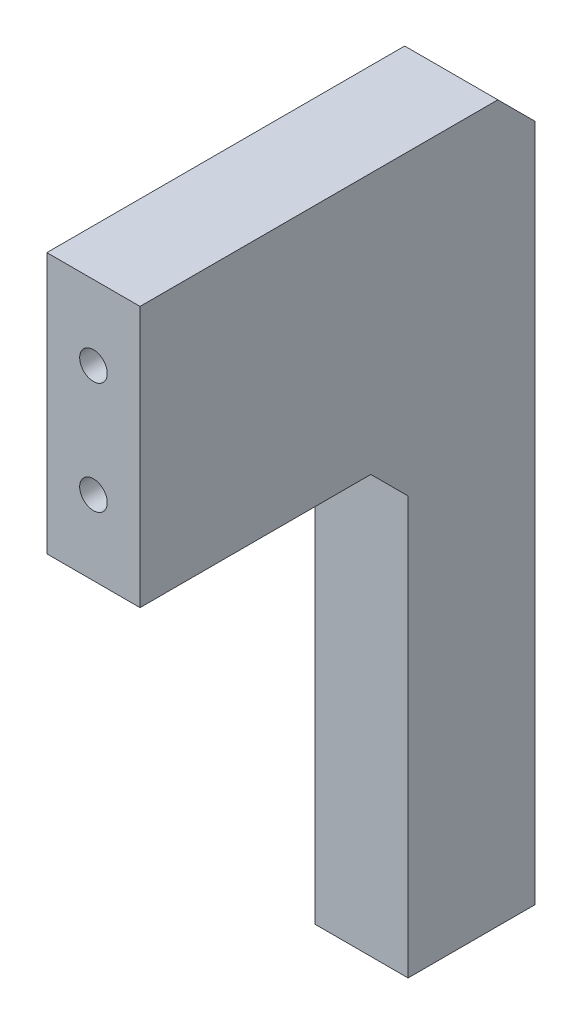
ISO-10303-21;
HEADER;
FILE_DESCRIPTION(('STEP AP214'),'2;1');
FILE_NAME('part.step','',(''),(''),'','','');
FILE_SCHEMA(('AUTOMOTIVE_DESIGN { 1 0 10303 214 1 1 1 1 }'));
ENDSEC;
DATA;
#1=APPLICATION_CONTEXT('core data for automotive mechanical design processes');
#2=APPLICATION_PROTOCOL_DEFINITION('international standard','automotive_design',2000,#1);
#3=PRODUCT_CONTEXT('',#1,'mechanical');
#4=PRODUCT('Part','Part','',(#3));
#5=PRODUCT_RELATED_PRODUCT_CATEGORY('part','',(#4));
#6=PRODUCT_DEFINITION_FORMATION('','',#4);
#7=PRODUCT_DEFINITION_CONTEXT('part definition',#1,'design');
#8=PRODUCT_DEFINITION('design','',#6,#7);
#9=PRODUCT_DEFINITION_SHAPE('','',#8);
#10=(LENGTH_UNIT() NAMED_UNIT(*) SI_UNIT(.MILLI.,.METRE.));
#11=(NAMED_UNIT(*) PLANE_ANGLE_UNIT() SI_UNIT($,.RADIAN.));
#12=(NAMED_UNIT(*) SI_UNIT($,.STERADIAN.) SOLID_ANGLE_UNIT());
#13=UNCERTAINTY_MEASURE_WITH_UNIT(LENGTH_MEASURE(1.E-05),#10,'distance_accuracy_value','');
#14=(GEOMETRIC_REPRESENTATION_CONTEXT(3) GLOBAL_UNCERTAINTY_ASSIGNED_CONTEXT((#13)) GLOBAL_UNIT_ASSIGNED_CONTEXT((#10,
#11,#12)) REPRESENTATION_CONTEXT('',''));
#15=CARTESIAN_POINT('',(0.,0.,0.));
#16=DIRECTION('',(0.,0.,1.));
#17=DIRECTION('',(1.,0.,0.));
#18=AXIS2_PLACEMENT_3D('',#15,#16,#17);
#19=CARTESIAN_POINT('',(6.25,96.,0.));
#20=DIRECTION('',(0.,0.,1.));
#21=DIRECTION('',(0.,-1.,0.));
#22=AXIS2_PLACEMENT_3D('',#19,#20,#21);
#23=PLANE('',#22);
#24=DIRECTION('',(0.,1.,0.));
#25=VECTOR('',#24,1.);
#26=CARTESIAN_POINT('',(-6.25,96.,0.));
#27=LINE('',#26,#25);
#28=CARTESIAN_POINT('',(-6.25,0.,0.));
#29=VERTEX_POINT('',#28);
#30=CARTESIAN_POINT('',(-6.25,91.,0.));
#31=VERTEX_POINT('',#30);
#32=EDGE_CURVE('E138',#29,#31,#27,.T.);
#33=ORIENTED_EDGE('',*,*,#32,.T.);
#34=DIRECTION('',(1.,0.,0.));
#35=VECTOR('',#34,1.);
#36=CARTESIAN_POINT('',(6.25,91.,0.));
#37=LINE('',#36,#35);
#38=CARTESIAN_POINT('',(6.25,91.,0.));
#39=VERTEX_POINT('',#38);
#40=EDGE_CURVE('E53',#31,#39,#37,.T.);
#41=ORIENTED_EDGE('',*,*,#40,.T.);
#42=DIRECTION('',(0.,1.,0.));
#43=VECTOR('',#42,1.);
#44=CARTESIAN_POINT('',(6.25,96.,0.));
#45=LINE('',#44,#43);
#46=CARTESIAN_POINT('',(6.25,0.,0.));
#47=VERTEX_POINT('',#46);
#48=EDGE_CURVE('E139',#47,#39,#45,.T.);
#49=ORIENTED_EDGE('',*,*,#48,.F.);
#50=DIRECTION('',(-1.,0.,0.));
#51=VECTOR('',#50,1.);
#52=CARTESIAN_POINT('',(6.25,0.,0.));
#53=LINE('',#52,#51);
#54=EDGE_CURVE('E153',#47,#29,#53,.T.);
#55=ORIENTED_EDGE('',*,*,#54,.T.);
#56=EDGE_LOOP('',(#33,#41,#49,#55));
#57=FACE_BOUND('',#56,.T.);
#58=ADVANCED_FACE('F38',(#57),#23,.F.);
#59=CARTESIAN_POINT('',(6.25,96.,53.));
#60=DIRECTION('',(0.,-1.,0.));
#61=DIRECTION('',(0.,0.,-1.));
#62=AXIS2_PLACEMENT_3D('',#59,#60,#61);
#63=PLANE('',#62);
#64=DIRECTION('',(0.,0.,1.));
#65=VECTOR('',#64,1.);
#66=CARTESIAN_POINT('',(6.25,96.,53.));
#67=LINE('',#66,#65);
#68=CARTESIAN_POINT('',(6.25,96.,4.99999999999999));
#69=VERTEX_POINT('',#68);
#70=CARTESIAN_POINT('',(6.25,96.,53.));
#71=VERTEX_POINT('',#70);
#72=EDGE_CURVE('E141',#69,#71,#67,.T.);
#73=ORIENTED_EDGE('',*,*,#72,.F.);
#74=DIRECTION('',(-1.,0.,0.));
#75=VECTOR('',#74,1.);
#76=CARTESIAN_POINT('',(6.25,96.,4.99999999999999));
#77=LINE('',#76,#75);
#78=CARTESIAN_POINT('',(-6.25,96.,4.99999999999999));
#79=VERTEX_POINT('',#78);
#80=EDGE_CURVE('E181',#69,#79,#77,.T.);
#81=ORIENTED_EDGE('',*,*,#80,.T.);
#82=DIRECTION('',(0.,0.,1.));
#83=VECTOR('',#82,1.);
#84=CARTESIAN_POINT('',(-6.25,96.,53.));
#85=LINE('',#84,#83);
#86=CARTESIAN_POINT('',(-6.25,96.,53.));
#87=VERTEX_POINT('',#86);
#88=EDGE_CURVE('E155',#79,#87,#85,.T.);
#89=ORIENTED_EDGE('',*,*,#88,.T.);
#90=DIRECTION('',(-1.,0.,0.));
#91=VECTOR('',#90,1.);
#92=CARTESIAN_POINT('',(6.25,96.,53.));
#93=LINE('',#92,#91);
#94=EDGE_CURVE('E173',#71,#87,#93,.T.);
#95=ORIENTED_EDGE('',*,*,#94,.F.);
#96=EDGE_LOOP('',(#73,#81,#89,#95));
#97=FACE_BOUND('',#96,.T.);
#98=ADVANCED_FACE('F216',(#97),#63,.F.);
#99=CARTESIAN_POINT('',(6.25,61.,53.));
#100=DIRECTION('',(0.,0.,-1.));
#101=DIRECTION('',(-1.,0.,0.));
#102=AXIS2_PLACEMENT_3D('',#99,#100,#101);
#103=PLANE('',#102);
#104=CARTESIAN_POINT('',(0.,86.,53.));
#105=DIRECTION('',(0.,0.,1.));
#106=DIRECTION('',(1.,0.,0.));
#107=AXIS2_PLACEMENT_3D('',#104,#105,#106);
#108=CIRCLE('',#107,1.85);
#109=CARTESIAN_POINT('',(1.85,86.,53.));
#110=VERTEX_POINT('',#109);
#111=EDGE_CURVE('E121',#110,#110,#108,.T.);
#112=ORIENTED_EDGE('',*,*,#111,.F.);
#113=EDGE_LOOP('',(#112));
#114=FACE_BOUND('',#113,.T.);
#115=CARTESIAN_POINT('',(0.,71.,53.));
#116=DIRECTION('',(0.,0.,1.));
#117=DIRECTION('',(1.,0.,0.));
#118=AXIS2_PLACEMENT_3D('',#115,#116,#117);
#119=CIRCLE('',#118,1.85);
#120=CARTESIAN_POINT('',(1.85,71.,53.));
#121=VERTEX_POINT('',#120);
#122=EDGE_CURVE('E132',#121,#121,#119,.T.);
#123=ORIENTED_EDGE('',*,*,#122,.F.);
#124=EDGE_LOOP('',(#123));
#125=FACE_BOUND('',#124,.T.);
#126=DIRECTION('',(0.,-1.,0.));
#127=VECTOR('',#126,1.);
#128=CARTESIAN_POINT('',(-6.25,61.,53.));
#129=LINE('',#128,#127);
#130=CARTESIAN_POINT('',(-6.25,61.,53.));
#131=VERTEX_POINT('',#130);
#132=EDGE_CURVE('E157',#87,#131,#129,.T.);
#133=ORIENTED_EDGE('',*,*,#132,.T.);
#134=DIRECTION('',(-1.,0.,0.));
#135=VECTOR('',#134,1.);
#136=CARTESIAN_POINT('',(6.25,61.,53.));
#137=LINE('',#136,#135);
#138=CARTESIAN_POINT('',(6.25,61.,53.));
#139=VERTEX_POINT('',#138);
#140=EDGE_CURVE('E170',#139,#131,#137,.T.);
#141=ORIENTED_EDGE('',*,*,#140,.F.);
#142=DIRECTION('',(0.,-1.,0.));
#143=VECTOR('',#142,1.);
#144=CARTESIAN_POINT('',(6.25,61.,53.));
#145=LINE('',#144,#143);
#146=EDGE_CURVE('E144',#71,#139,#145,.T.);
#147=ORIENTED_EDGE('',*,*,#146,.F.);
#148=ORIENTED_EDGE('',*,*,#94,.T.);
#149=EDGE_LOOP('',(#133,#141,#147,#148));
#150=FACE_BOUND('',#149,.T.);
#151=ADVANCED_FACE('F219',(#114,#125,#150),#103,.F.);
#152=CARTESIAN_POINT('',(6.25,61.,17.045));
#153=DIRECTION('',(0.,1.,0.));
#154=DIRECTION('',(0.,0.,1.));
#155=AXIS2_PLACEMENT_3D('',#152,#153,#154);
#156=PLANE('',#155);
#157=DIRECTION('',(0.,0.,-1.));
#158=VECTOR('',#157,1.);
#159=CARTESIAN_POINT('',(-6.25,61.,17.045));
#160=LINE('',#159,#158);
#161=CARTESIAN_POINT('',(-6.25,61.,22.045));
#162=VERTEX_POINT('',#161);
#163=EDGE_CURVE('E159',#131,#162,#160,.T.);
#164=ORIENTED_EDGE('',*,*,#163,.T.);
#165=DIRECTION('',(1.,0.,0.));
#166=VECTOR('',#165,1.);
#167=CARTESIAN_POINT('',(6.25,61.,22.045));
#168=LINE('',#167,#166);
#169=CARTESIAN_POINT('',(6.25,61.,22.045));
#170=VERTEX_POINT('',#169);
#171=EDGE_CURVE('E179',#162,#170,#168,.T.);
#172=ORIENTED_EDGE('',*,*,#171,.T.);
#173=DIRECTION('',(0.,0.,-1.));
#174=VECTOR('',#173,1.);
#175=CARTESIAN_POINT('',(6.25,61.,17.045));
#176=LINE('',#175,#174);
#177=EDGE_CURVE('E146',#139,#170,#176,.T.);
#178=ORIENTED_EDGE('',*,*,#177,.F.);
#179=ORIENTED_EDGE('',*,*,#140,.T.);
#180=EDGE_LOOP('',(#164,#172,#178,#179));
#181=FACE_BOUND('',#180,.T.);
#182=ADVANCED_FACE('F196',(#181),#156,.F.);
#183=CARTESIAN_POINT('',(6.25,0.,17.045));
#184=DIRECTION('',(0.,0.,-1.));
#185=DIRECTION('',(-1.,0.,0.));
#186=AXIS2_PLACEMENT_3D('',#183,#184,#185);
#187=PLANE('',#186);
#188=DIRECTION('',(0.,-1.,0.));
#189=VECTOR('',#188,1.);
#190=CARTESIAN_POINT('',(6.25,0.,17.045));
#191=LINE('',#190,#189);
#192=CARTESIAN_POINT('',(6.25,56.,17.045));
#193=VERTEX_POINT('',#192);
#194=CARTESIAN_POINT('',(6.25,0.,17.045));
#195=VERTEX_POINT('',#194);
#196=EDGE_CURVE('E149',#193,#195,#191,.T.);
#197=ORIENTED_EDGE('',*,*,#196,.F.);
#198=DIRECTION('',(-1.,0.,0.));
#199=VECTOR('',#198,1.);
#200=CARTESIAN_POINT('',(-6.25,56.,17.045));
#201=LINE('',#200,#199);
#202=CARTESIAN_POINT('',(-6.25,56.,17.045));
#203=VERTEX_POINT('',#202);
#204=EDGE_CURVE('E176',#193,#203,#201,.T.);
#205=ORIENTED_EDGE('',*,*,#204,.T.);
#206=DIRECTION('',(0.,-1.,0.));
#207=VECTOR('',#206,1.);
#208=CARTESIAN_POINT('',(-6.25,0.,17.045));
#209=LINE('',#208,#207);
#210=CARTESIAN_POINT('',(-6.25,0.,17.045));
#211=VERTEX_POINT('',#210);
#212=EDGE_CURVE('E162',#203,#211,#209,.T.);
#213=ORIENTED_EDGE('',*,*,#212,.T.);
#214=DIRECTION('',(-1.,0.,0.));
#215=VECTOR('',#214,1.);
#216=CARTESIAN_POINT('',(6.25,0.,17.045));
#217=LINE('',#216,#215);
#218=EDGE_CURVE('E167',#195,#211,#217,.T.);
#219=ORIENTED_EDGE('',*,*,#218,.F.);
#220=EDGE_LOOP('',(#197,#205,#213,#219));
#221=FACE_BOUND('',#220,.T.);
#222=ADVANCED_FACE('F206',(#221),#187,.F.);
#223=CARTESIAN_POINT('',(6.25,0.,0.));
#224=DIRECTION('',(0.,1.,0.));
#225=DIRECTION('',(0.,0.,1.));
#226=AXIS2_PLACEMENT_3D('',#223,#224,#225);
#227=PLANE('',#226);
#228=CARTESIAN_POINT('',(0.,0.,10.22));
#229=DIRECTION('',(0.,-1.,0.));
#230=DIRECTION('',(0.,0.,-1.));
#231=AXIS2_PLACEMENT_3D('',#228,#229,#230);
#232=CIRCLE('',#231,1.85);
#233=CARTESIAN_POINT('',(0.,0.,8.37));
#234=VERTEX_POINT('',#233);
#235=EDGE_CURVE('E122',#234,#234,#232,.T.);
#236=ORIENTED_EDGE('',*,*,#235,.F.);
#237=EDGE_LOOP('',(#236));
#238=FACE_BOUND('',#237,.T.);
#239=DIRECTION('',(0.,0.,-1.));
#240=VECTOR('',#239,1.);
#241=CARTESIAN_POINT('',(-6.25,0.,0.));
#242=LINE('',#241,#240);
#243=EDGE_CURVE('E142',#211,#29,#242,.T.);
#244=ORIENTED_EDGE('',*,*,#243,.T.);
#245=ORIENTED_EDGE('',*,*,#54,.F.);
#246=DIRECTION('',(0.,0.,-1.));
#247=VECTOR('',#246,1.);
#248=CARTESIAN_POINT('',(6.25,0.,0.));
#249=LINE('',#248,#247);
#250=EDGE_CURVE('E151',#195,#47,#249,.T.);
#251=ORIENTED_EDGE('',*,*,#250,.F.);
#252=ORIENTED_EDGE('',*,*,#218,.T.);
#253=EDGE_LOOP('',(#244,#245,#251,#252));
#254=FACE_BOUND('',#253,.T.);
#255=ADVANCED_FACE('F210',(#238,#254),#227,.F.);
#256=CARTESIAN_POINT('',(6.25,0.,0.));
#257=DIRECTION('',(-1.,0.,0.));
#258=DIRECTION('',(0.,0.,1.));
#259=AXIS2_PLACEMENT_3D('',#256,#257,#258);
#260=PLANE('',#259);
#261=ORIENTED_EDGE('',*,*,#48,.T.);
#262=DIRECTION('',(0.,-0.70710678118655,-0.707106781186546));
#263=VECTOR('',#262,1.);
#264=CARTESIAN_POINT('',(6.25,96.,4.99999999999999));
#265=LINE('',#264,#263);
#266=EDGE_CURVE('E186',#39,#69,#265,.F.);
#267=ORIENTED_EDGE('',*,*,#266,.T.);
#268=ORIENTED_EDGE('',*,*,#72,.T.);
#269=ORIENTED_EDGE('',*,*,#146,.T.);
#270=ORIENTED_EDGE('',*,*,#177,.T.);
#271=DIRECTION('',(0.,0.707106781186551,0.707106781186544));
#272=VECTOR('',#271,1.);
#273=CARTESIAN_POINT('',(6.25,19.4774999999997,-19.4774999999999));
#274=LINE('',#273,#272);
#275=EDGE_CURVE('E11',#170,#193,#274,.F.);
#276=ORIENTED_EDGE('',*,*,#275,.T.);
#277=ORIENTED_EDGE('',*,*,#196,.T.);
#278=ORIENTED_EDGE('',*,*,#250,.T.);
#279=EDGE_LOOP('',(#261,#267,#268,#269,#270,#276,#277,#278));
#280=FACE_BOUND('',#279,.T.);
#281=ADVANCED_FACE('F203',(#280),#260,.F.);
#282=CARTESIAN_POINT('',(-6.25,0.,0.));
#283=DIRECTION('',(-1.,0.,0.));
#284=DIRECTION('',(0.,0.,1.));
#285=AXIS2_PLACEMENT_3D('',#282,#283,#284);
#286=PLANE('',#285);
#287=ORIENTED_EDGE('',*,*,#88,.F.);
#288=DIRECTION('',(0.,0.70710678118655,0.707106781186546));
#289=VECTOR('',#288,1.);
#290=CARTESIAN_POINT('',(-6.25,45.4999999999997,-45.5));
#291=LINE('',#290,#289);
#292=EDGE_CURVE('E61',#79,#31,#291,.F.);
#293=ORIENTED_EDGE('',*,*,#292,.T.);
#294=ORIENTED_EDGE('',*,*,#32,.F.);
#295=ORIENTED_EDGE('',*,*,#243,.F.);
#296=ORIENTED_EDGE('',*,*,#212,.F.);
#297=DIRECTION('',(0.,-0.707106781186551,-0.707106781186544));
#298=VECTOR('',#297,1.);
#299=CARTESIAN_POINT('',(-6.25,56.,17.045));
#300=LINE('',#299,#298);
#301=EDGE_CURVE('E46',#203,#162,#300,.F.);
#302=ORIENTED_EDGE('',*,*,#301,.T.);
#303=ORIENTED_EDGE('',*,*,#163,.F.);
#304=ORIENTED_EDGE('',*,*,#132,.F.);
#305=EDGE_LOOP('',(#287,#293,#294,#295,#296,#302,#303,#304));
#306=FACE_BOUND('',#305,.T.);
#307=ADVANCED_FACE('F189',(#306),#286,.T.);
#308=CARTESIAN_POINT('',(6.25,56.,17.045));
#309=DIRECTION('',(0.,-0.707106781186544,0.707106781186551));
#310=DIRECTION('',(1.,0.,0.));
#311=AXIS2_PLACEMENT_3D('',#308,#309,#310);
#312=PLANE('',#311);
#313=ORIENTED_EDGE('',*,*,#275,.F.);
#314=ORIENTED_EDGE('',*,*,#171,.F.);
#315=ORIENTED_EDGE('',*,*,#301,.F.);
#316=ORIENTED_EDGE('',*,*,#204,.F.);
#317=EDGE_LOOP('',(#313,#314,#315,#316));
#318=FACE_BOUND('',#317,.T.);
#319=ADVANCED_FACE('F200',(#318),#312,.T.);
#320=CARTESIAN_POINT('',(6.25,96.,4.99999999999999));
#321=DIRECTION('',(0.,-0.707106781186545,0.707106781186549));
#322=DIRECTION('',(-1.,0.,0.));
#323=AXIS2_PLACEMENT_3D('',#320,#321,#322);
#324=PLANE('',#323);
#325=ORIENTED_EDGE('',*,*,#266,.F.);
#326=ORIENTED_EDGE('',*,*,#40,.F.);
#327=ORIENTED_EDGE('',*,*,#292,.F.);
#328=ORIENTED_EDGE('',*,*,#80,.F.);
#329=EDGE_LOOP('',(#325,#326,#327,#328));
#330=FACE_BOUND('',#329,.T.);
#331=ADVANCED_FACE('F40',(#330),#324,.F.);
#332=CARTESIAN_POINT('',(0.,71.,41.));
#333=DIRECTION('',(0.,0.,1.));
#334=DIRECTION('',(1.,0.,0.));
#335=AXIS2_PLACEMENT_3D('',#332,#333,#334);
#336=CONICAL_SURFACE('',#335,1.85,1.02974425867665);
#337=CARTESIAN_POINT('',(0.,71.,39.888407854799));
#338=VERTEX_POINT('',#337);
#339=VERTEX_LOOP('',#338);
#340=FACE_BOUND('',#339,.T.);
#341=CARTESIAN_POINT('',(0.,71.,41.));
#342=DIRECTION('',(0.,0.,1.));
#343=DIRECTION('',(1.,0.,0.));
#344=AXIS2_PLACEMENT_3D('',#341,#342,#343);
#345=CIRCLE('',#344,1.85);
#346=CARTESIAN_POINT('',(1.85,71.,41.));
#347=VERTEX_POINT('',#346);
#348=EDGE_CURVE('E135',#347,#347,#345,.T.);
#349=ORIENTED_EDGE('',*,*,#348,.T.);
#350=EDGE_LOOP('',(#349));
#351=FACE_BOUND('',#350,.T.);
#352=ADVANCED_FACE('F241',(#340,#351),#336,.F.);
#353=CARTESIAN_POINT('',(0.,71.,53.));
#354=DIRECTION('',(0.,0.,1.));
#355=DIRECTION('',(1.,0.,0.));
#356=AXIS2_PLACEMENT_3D('',#353,#354,#355);
#357=CYLINDRICAL_SURFACE('',#356,1.85);
#358=ORIENTED_EDGE('',*,*,#348,.F.);
#359=EDGE_LOOP('',(#358));
#360=FACE_BOUND('',#359,.T.);
#361=ORIENTED_EDGE('',*,*,#122,.T.);
#362=EDGE_LOOP('',(#361));
#363=FACE_BOUND('',#362,.T.);
#364=ADVANCED_FACE('F296',(#360,#363),#357,.F.);
#365=CARTESIAN_POINT('',(0.,86.,41.));
#366=DIRECTION('',(0.,0.,1.));
#367=DIRECTION('',(1.,0.,0.));
#368=AXIS2_PLACEMENT_3D('',#365,#366,#367);
#369=CONICAL_SURFACE('',#368,1.85,1.02974425867665);
#370=CARTESIAN_POINT('',(0.,86.,39.888407854799));
#371=VERTEX_POINT('',#370);
#372=VERTEX_LOOP('',#371);
#373=FACE_BOUND('',#372,.T.);
#374=CARTESIAN_POINT('',(0.,86.,41.));
#375=DIRECTION('',(0.,0.,1.));
#376=DIRECTION('',(1.,0.,0.));
#377=AXIS2_PLACEMENT_3D('',#374,#375,#376);
#378=CIRCLE('',#377,1.85);
#379=CARTESIAN_POINT('',(1.85,86.,41.));
#380=VERTEX_POINT('',#379);
#381=EDGE_CURVE('E125',#380,#380,#378,.T.);
#382=ORIENTED_EDGE('',*,*,#381,.T.);
#383=EDGE_LOOP('',(#382));
#384=FACE_BOUND('',#383,.T.);
#385=ADVANCED_FACE('F305',(#373,#384),#369,.F.);
#386=CARTESIAN_POINT('',(0.,86.,53.));
#387=DIRECTION('',(0.,0.,1.));
#388=DIRECTION('',(1.,0.,0.));
#389=AXIS2_PLACEMENT_3D('',#386,#387,#388);
#390=CYLINDRICAL_SURFACE('',#389,1.85);
#391=ORIENTED_EDGE('',*,*,#381,.F.);
#392=EDGE_LOOP('',(#391));
#393=FACE_BOUND('',#392,.T.);
#394=ORIENTED_EDGE('',*,*,#111,.T.);
#395=EDGE_LOOP('',(#394));
#396=FACE_BOUND('',#395,.T.);
#397=ADVANCED_FACE('F115',(#393,#396),#390,.F.);
#398=CARTESIAN_POINT('',(0.,20.,10.22));
#399=DIRECTION('',(0.,-1.,0.));
#400=DIRECTION('',(0.,0.,-1.));
#401=AXIS2_PLACEMENT_3D('',#398,#399,#400);
#402=CONICAL_SURFACE('',#401,1.84999999999999,1.02974425867665);
#403=CARTESIAN_POINT('',(0.,21.111592145201,10.22));
#404=VERTEX_POINT('',#403);
#405=VERTEX_LOOP('',#404);
#406=FACE_BOUND('',#405,.T.);
#407=CARTESIAN_POINT('',(0.,20.,10.22));
#408=DIRECTION('',(0.,-1.,0.));
#409=DIRECTION('',(0.,0.,-1.));
#410=AXIS2_PLACEMENT_3D('',#407,#408,#409);
#411=CIRCLE('',#410,1.84999999999999);
#412=CARTESIAN_POINT('',(0.,20.,8.37000000000001));
#413=VERTEX_POINT('',#412);
#414=EDGE_CURVE('E119',#413,#413,#411,.T.);
#415=ORIENTED_EDGE('',*,*,#414,.T.);
#416=EDGE_LOOP('',(#415));
#417=FACE_BOUND('',#416,.T.);
#418=ADVANCED_FACE('F111',(#406,#417),#402,.F.);
#419=CARTESIAN_POINT('',(0.,0.,10.22));
#420=DIRECTION('',(0.,-1.,0.));
#421=DIRECTION('',(0.,0.,-1.));
#422=AXIS2_PLACEMENT_3D('',#419,#420,#421);
#423=CYLINDRICAL_SURFACE('',#422,1.85);
#424=ORIENTED_EDGE('',*,*,#414,.F.);
#425=EDGE_LOOP('',(#424));
#426=FACE_BOUND('',#425,.T.);
#427=ORIENTED_EDGE('',*,*,#235,.T.);
#428=EDGE_LOOP('',(#427));
#429=FACE_BOUND('',#428,.T.);
#430=ADVANCED_FACE('F114',(#426,#429),#423,.F.);
#431=CLOSED_SHELL('',(#58,#98,#151,#182,#222,#255,#281,#307,#319,#331,#352,#364,#385,#397,#418,#430));
#432=MANIFOLD_SOLID_BREP('B2',#431);
#433=ADVANCED_BREP_SHAPE_REPRESENTATION('',(#18,#432),#14);
#434=SHAPE_DEFINITION_REPRESENTATION(#9,#433);
ENDSEC;
END-ISO-10303-21;
